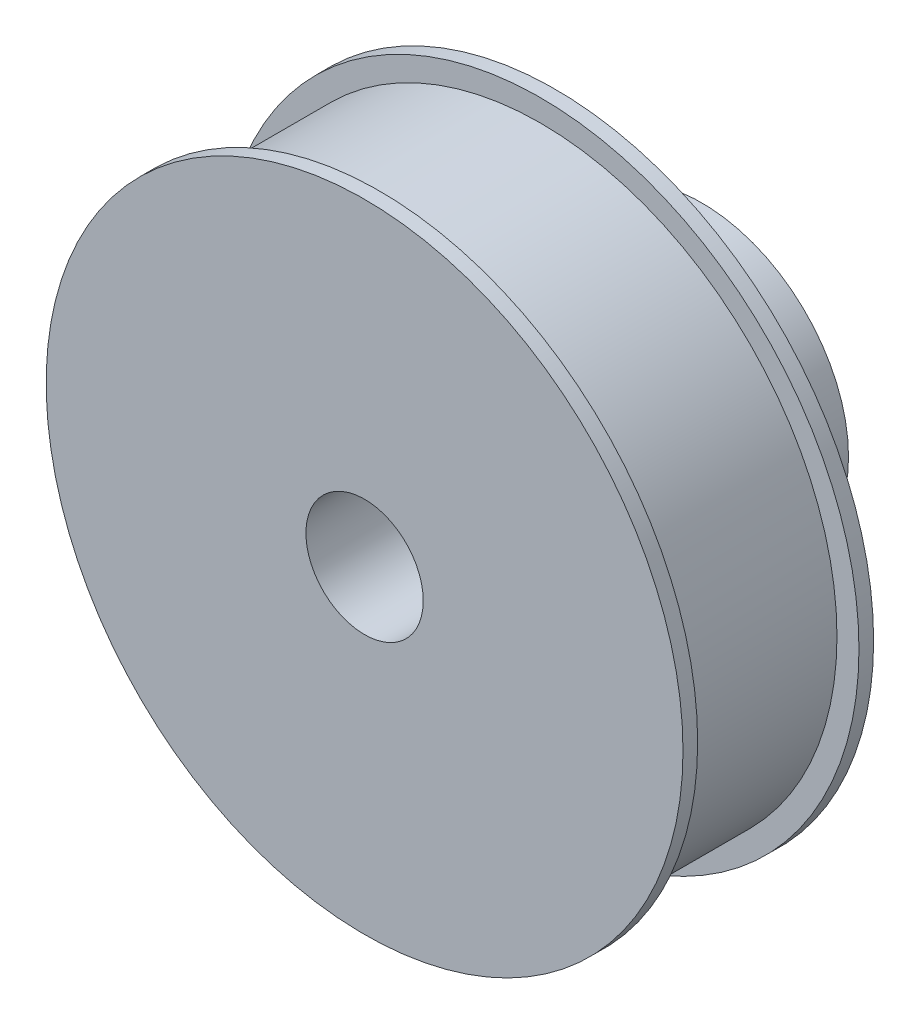
ISO-10303-21;
HEADER;
FILE_DESCRIPTION(('STEP AP214'),'2;1');
FILE_NAME('part.step','',(''),(''),'','','');
FILE_SCHEMA(('AUTOMOTIVE_DESIGN { 1 0 10303 214 1 1 1 1 }'));
ENDSEC;
DATA;
#1=APPLICATION_CONTEXT('core data for automotive mechanical design processes');
#2=APPLICATION_PROTOCOL_DEFINITION('international standard','automotive_design',2000,#1);
#3=PRODUCT_CONTEXT('',#1,'mechanical');
#4=PRODUCT('Part','Part','',(#3));
#5=PRODUCT_RELATED_PRODUCT_CATEGORY('part','',(#4));
#6=PRODUCT_DEFINITION_FORMATION('','',#4);
#7=PRODUCT_DEFINITION_CONTEXT('part definition',#1,'design');
#8=PRODUCT_DEFINITION('design','',#6,#7);
#9=PRODUCT_DEFINITION_SHAPE('','',#8);
#10=(LENGTH_UNIT() NAMED_UNIT(*) SI_UNIT(.MILLI.,.METRE.));
#11=(NAMED_UNIT(*) PLANE_ANGLE_UNIT() SI_UNIT($,.RADIAN.));
#12=(NAMED_UNIT(*) SI_UNIT($,.STERADIAN.) SOLID_ANGLE_UNIT());
#13=UNCERTAINTY_MEASURE_WITH_UNIT(LENGTH_MEASURE(1.E-05),#10,'distance_accuracy_value','');
#14=(GEOMETRIC_REPRESENTATION_CONTEXT(3) GLOBAL_UNCERTAINTY_ASSIGNED_CONTEXT((#13)) GLOBAL_UNIT_ASSIGNED_CONTEXT((#10,
#11,#12)) REPRESENTATION_CONTEXT('',''));
#15=CARTESIAN_POINT('',(0.,0.,0.));
#16=DIRECTION('',(0.,0.,1.));
#17=DIRECTION('',(1.,0.,0.));
#18=AXIS2_PLACEMENT_3D('',#15,#16,#17);
#19=CARTESIAN_POINT('',(0.,0.,-23.));
#20=DIRECTION('',(0.,0.,1.));
#21=DIRECTION('',(1.,0.,0.));
#22=AXIS2_PLACEMENT_3D('',#19,#20,#21);
#23=PLANE('',#22);
#24=CARTESIAN_POINT('',(0.,0.,-23.));
#25=DIRECTION('',(0.,0.,1.));
#26=DIRECTION('',(1.,0.,0.));
#27=AXIS2_PLACEMENT_3D('',#24,#25,#26);
#28=CIRCLE('',#27,4.);
#29=CARTESIAN_POINT('',(4.,0.,-23.));
#30=VERTEX_POINT('',#29);
#31=EDGE_CURVE('E77',#30,#30,#28,.T.);
#32=ORIENTED_EDGE('',*,*,#31,.T.);
#33=EDGE_LOOP('',(#32));
#34=FACE_BOUND('',#33,.T.);
#35=CARTESIAN_POINT('',(0.,0.,-23.));
#36=DIRECTION('',(0.,0.,1.));
#37=DIRECTION('',(1.,0.,0.));
#38=AXIS2_PLACEMENT_3D('',#35,#36,#37);
#39=CIRCLE('',#38,10.);
#40=CARTESIAN_POINT('',(10.,0.,-23.));
#41=VERTEX_POINT('',#40);
#42=EDGE_CURVE('E10',#41,#41,#39,.T.);
#43=ORIENTED_EDGE('',*,*,#42,.F.);
#44=EDGE_LOOP('',(#43));
#45=FACE_BOUND('',#44,.T.);
#46=ADVANCED_FACE('F32',(#34,#45),#23,.F.);
#47=CARTESIAN_POINT('',(0.,0.,0.));
#48=DIRECTION('',(0.,0.,1.));
#49=DIRECTION('',(1.,0.,0.));
#50=AXIS2_PLACEMENT_3D('',#47,#48,#49);
#51=CYLINDRICAL_SURFACE('',#50,10.);
#52=CARTESIAN_POINT('',(-10.,0.,-19.5));
#53=CARTESIAN_POINT('',(-9.99999865771297,0.0837515444816418,-19.4999965461847));
#54=CARTESIAN_POINT('',(-9.9989368253704,0.167551685082131,-19.4929619991594));
#55=CARTESIAN_POINT('',(-9.99480315973187,0.332809627994912,-19.4650168000172));
#56=CARTESIAN_POINT('',(-9.99172936938473,0.414265068974227,-19.4440926370551));
#57=CARTESIAN_POINT('',(-9.98391721219525,0.572418086221858,-19.3890074950324));
#58=CARTESIAN_POINT('',(-9.97918010370919,0.649119207826797,-19.354856520494));
#59=CARTESIAN_POINT('',(-9.96856475911724,0.795690428635252,-19.2743116205831));
#60=CARTESIAN_POINT('',(-9.96268668152773,0.865561474725186,-19.2279193955826));
#61=CARTESIAN_POINT('',(-9.95039170991452,0.997046719562123,-19.1238227350601));
#62=CARTESIAN_POINT('',(-9.94397133890331,1.0585998322255,-19.0660415437918));
#63=CARTESIAN_POINT('',(-9.93134261133238,1.17117490668948,-18.9409723111061));
#64=CARTESIAN_POINT('',(-9.92513426698505,1.22219626272935,-18.8736837232215));
#65=CARTESIAN_POINT('',(-9.91359877458726,1.31249729499943,-18.7310993564775));
#66=CARTESIAN_POINT('',(-9.90827611975031,1.35171787037205,-18.6557657530186));
#67=CARTESIAN_POINT('',(-9.89916211306267,1.41692632171056,-18.4994871793546));
#68=CARTESIAN_POINT('',(-9.89537067775448,1.44291491889163,-18.4185425152561));
#69=CARTESIAN_POINT('',(-9.88978256218673,1.48073198798911,-18.2539819581283));
#70=CARTESIAN_POINT('',(-9.8879711574125,1.49266503640517,-18.170390606592));
#71=CARTESIAN_POINT('',(-9.88650348970582,1.50235624033932,-18.0023738340127));
#72=CARTESIAN_POINT('',(-9.88684710303147,1.50011520973796,-17.9179484611375));
#73=CARTESIAN_POINT('',(-9.88963718352409,1.48160733250787,-17.7513989198058));
#74=CARTESIAN_POINT('',(-9.89206618761549,1.4654569592775,-17.6692614735152));
#75=CARTESIAN_POINT('',(-9.89872608126367,1.41977117403734,-17.5088756311285));
#76=CARTESIAN_POINT('',(-9.90295702179379,1.39023538337812,-17.4306273451192));
#77=CARTESIAN_POINT('',(-9.91276335545481,1.31849603529736,-17.2798866287171));
#78=CARTESIAN_POINT('',(-9.91834396766526,1.27624314283198,-17.2074180309076));
#79=CARTESIAN_POINT('',(-9.93021707574547,1.18030413128955,-17.0705554042181));
#80=CARTESIAN_POINT('',(-9.936509618325,1.12661726182478,-17.0061619057306));
#81=CARTESIAN_POINT('',(-9.94917473056209,1.00869493078248,-16.8866023392603));
#82=CARTESIAN_POINT('',(-9.95554747112815,0.944359329642001,-16.8315350097137));
#83=CARTESIAN_POINT('',(-9.96759647648462,0.807307089894186,-16.7329640654927));
#84=CARTESIAN_POINT('',(-9.9732727382251,0.734590414588169,-16.6894605014561));
#85=CARTESIAN_POINT('',(-9.98329515585393,0.582754598213685,-16.6152469135004));
#86=CARTESIAN_POINT('',(-9.98764051925427,0.50363167783678,-16.5845445081597));
#87=CARTESIAN_POINT('',(-9.99450490557069,0.341273182487062,-16.5368906103146));
#88=CARTESIAN_POINT('',(-9.99702405195467,0.258037885952602,-16.5199381881844));
#89=CARTESIAN_POINT('',(-9.99993581133871,0.0906695676436483,-16.5003967701833));
#90=CARTESIAN_POINT('',(-10.0003485209039,0.00655273187047231,-16.4976720286207));
#91=CARTESIAN_POINT('',(-9.99905561015226,-0.160936677662281,-16.506303005311));
#92=CARTESIAN_POINT('',(-9.99735005541368,-0.244309274381875,-16.5176582876681));
#93=CARTESIAN_POINT('',(-9.99202468615333,-0.407532387431406,-16.5540141001775));
#94=CARTESIAN_POINT('',(-9.98841415207984,-0.487397963079836,-16.5789484960308));
#95=CARTESIAN_POINT('',(-9.97968235658369,-0.641814958642998,-16.6416849974617));
#96=CARTESIAN_POINT('',(-9.97456102421565,-0.716366128795097,-16.6794877073336));
#97=CARTESIAN_POINT('',(-9.96332682468686,-0.858634979291919,-16.7672062245639));
#98=CARTESIAN_POINT('',(-9.95720701626745,-0.926299009891564,-16.8172081400128));
#99=CARTESIAN_POINT('',(-9.94467863012165,-1.0523236731777,-16.9277858116287));
#100=CARTESIAN_POINT('',(-9.93827003562867,-1.1106837647934,-16.9883621823246));
#101=CARTESIAN_POINT('',(-9.92582264304494,-1.21693784957195,-17.1189735331765));
#102=CARTESIAN_POINT('',(-9.91978736017588,-1.26474084747421,-17.1890829251948));
#103=CARTESIAN_POINT('',(-9.90883219104903,-1.34789129270584,-17.3364160405118));
#104=CARTESIAN_POINT('',(-9.90391227465628,-1.38323907656435,-17.4136395715215));
#105=CARTESIAN_POINT('',(-9.89577033008645,-1.44033467323943,-17.5727375336231));
#106=CARTESIAN_POINT('',(-9.89254233006438,-1.46213037141635,-17.6545944609712));
#107=CARTESIAN_POINT('',(-9.88813382297802,-1.49165549501586,-17.8208590154351));
#108=CARTESIAN_POINT('',(-9.88695317451771,-1.49938589183066,-17.9052664659947));
#109=CARTESIAN_POINT('',(-9.88677832610841,-1.50053786669439,-18.0733290633158));
#110=CARTESIAN_POINT('',(-9.88776226333502,-1.49410252167312,-18.1569832417569));
#111=CARTESIAN_POINT('',(-9.89175820611174,-1.46741229544378,-18.3220052633235));
#112=CARTESIAN_POINT('',(-9.89477020841117,-1.44715743638627,-18.4033731101134));
#113=CARTESIAN_POINT('',(-9.90247526112297,-1.39345373518665,-18.5614730822343));
#114=CARTESIAN_POINT('',(-9.90716703716075,-1.36001489324314,-18.6382086704334));
#115=CARTESIAN_POINT('',(-9.91770454557702,-1.28090667642309,-18.7850036338024));
#116=CARTESIAN_POINT('',(-9.92355031702723,-1.23523688741502,-18.8550627828036));
#117=CARTESIAN_POINT('',(-9.93580743364938,-1.13244337659164,-18.9872430579752));
#118=CARTESIAN_POINT('',(-9.94222367881967,-1.07521369039805,-19.0492813332471));
#119=CARTESIAN_POINT('',(-9.95485788826636,-0.951148841082832,-19.1629245547878));
#120=CARTESIAN_POINT('',(-9.96107580610759,-0.884311448350939,-19.2145270725761));
#121=CARTESIAN_POINT('',(-9.9726518579052,-0.74249570754372,-19.3060876766074));
#122=CARTESIAN_POINT('',(-9.9780050712882,-0.667474576764758,-19.3459801092147));
#123=CARTESIAN_POINT('',(-9.98720028802959,-0.511751870248718,-19.412538516758));
#124=CARTESIAN_POINT('',(-9.99104385565757,-0.431056277096703,-19.4392181900537));
#125=CARTESIAN_POINT('',(-9.99590939261505,-0.291665727889329,-19.4725413427101));
#126=CARTESIAN_POINT('',(-9.99743549179556,-0.233831133495278,-19.4828226015388));
#127=CARTESIAN_POINT('',(-9.99948125947895,-0.117338971600125,-19.4965530977126));
#128=CARTESIAN_POINT('',(-10.0000009404877,-0.0586814143344173,-19.5000024199525));
#129=CARTESIAN_POINT('',(-10.,0.,-19.5));
#130=B_SPLINE_CURVE_WITH_KNOTS('',3,(#52,#53,#54,#55,#56,#57,#58,#59,#60,#61,#62,#63,#64,#65,
#66,#67,#68,#69,#70,#71,#72,#73,#74,#75,#76,#77,#78,#79,#80,#81,#82,#83,#84,#85,#86,#87,#88,#89,
#90,#91,#92,#93,#94,#95,#96,#97,#98,#99,#100,#101,#102,#103,#104,#105,#106,#107,#108,#109,#110,
#111,#112,#113,#114,#115,#116,#117,#118,#119,#120,#121,#122,#123,#124,#125,#126,#127,#128,#129),
.UNSPECIFIED.,.T.,.F.,(4,2,2,2,2,2,2,2,2,2,2,2,2,2,2,2,2,2,2,2,2,2,2,2,2,2,2,2,2,2,2,2,2,2,2,2,
2,2,4),(0.,0.251040205031662,0.502324962929149,0.753420023583235,1.00448022419759,
1.25729416136843,1.5101226357258,1.76419702395375,2.01825756225505,2.27041564605924,
2.52255925098982,2.77261177195746,3.0226713669036,3.27371383476158,3.52477278308533,
3.77834291255408,4.03191415238667,4.28563608984873,4.539340871934,4.79062058544254,
5.04189251991154,5.29195148965947,5.54202220376272,5.79391188036906,6.04581620028628,
6.2998136658467,6.55380426808831,6.80689223457167,7.05996272137175,7.31048888261063,
7.56101464229562,7.81135073984145,8.06169531466878,8.31444829965719,8.56726003468731,
8.82146323384731,9.0754023326144,9.25129851978806,9.42719252123289),.UNSPECIFIED.);
#131=CARTESIAN_POINT('',(-10.,0.,-19.5));
#132=VERTEX_POINT('',#131);
#133=EDGE_CURVE('E57',#132,#132,#130,.T.);
#134=ORIENTED_EDGE('',*,*,#133,.T.);
#135=EDGE_LOOP('',(#134));
#136=FACE_BOUND('',#135,.T.);
#137=CARTESIAN_POINT('',(0.,-10.,-16.5));
#138=CARTESIAN_POINT('',(0.083751544481642,-9.99999865771297,-16.5000034538152));
#139=CARTESIAN_POINT('',(0.167551685082132,-9.9989368253704,-16.5070380008406));
#140=CARTESIAN_POINT('',(0.332809627994913,-9.99480315973187,-16.5349831999827));
#141=CARTESIAN_POINT('',(0.414265068974229,-9.99172936938473,-16.5559073629449));
#142=CARTESIAN_POINT('',(0.572418086221859,-9.98391721219525,-16.6109925049676));
#143=CARTESIAN_POINT('',(0.649119207826798,-9.97918010370919,-16.6451434795059));
#144=CARTESIAN_POINT('',(0.795690428635254,-9.96856475911724,-16.7256883794168));
#145=CARTESIAN_POINT('',(0.865561474725189,-9.96268668152772,-16.7720806044174));
#146=CARTESIAN_POINT('',(0.997046719562127,-9.95039170991452,-16.8761772649399));
#147=CARTESIAN_POINT('',(1.0585998322255,-9.94397133890331,-16.9339584562082));
#148=CARTESIAN_POINT('',(1.17117490668949,-9.93134261133238,-17.0590276888939));
#149=CARTESIAN_POINT('',(1.22219626272936,-9.92513426698505,-17.1263162767785));
#150=CARTESIAN_POINT('',(1.31249729499943,-9.91359877458726,-17.2689006435225));
#151=CARTESIAN_POINT('',(1.35171787037205,-9.90827611975031,-17.3442342469813));
#152=CARTESIAN_POINT('',(1.41692632171056,-9.89916211306267,-17.5005128206454));
#153=CARTESIAN_POINT('',(1.44291491889163,-9.89537067775448,-17.5814574847439));
#154=CARTESIAN_POINT('',(1.48073198798911,-9.88978256218673,-17.7460180418717));
#155=CARTESIAN_POINT('',(1.49266503640518,-9.8879711574125,-17.829609393408));
#156=CARTESIAN_POINT('',(1.50235624033932,-9.88650348970582,-17.9976261659873));
#157=CARTESIAN_POINT('',(1.50011520973796,-9.88684710303147,-18.0820515388625));
#158=CARTESIAN_POINT('',(1.48160733250788,-9.88963718352409,-18.2486010801941));
#159=CARTESIAN_POINT('',(1.4654569592775,-9.89206618761549,-18.3307385264848));
#160=CARTESIAN_POINT('',(1.41977117403734,-9.89872608126367,-18.4911243688715));
#161=CARTESIAN_POINT('',(1.39023538337812,-9.90295702179379,-18.5693726548807));
#162=CARTESIAN_POINT('',(1.31849603529737,-9.91276335545481,-18.7201133712828));
#163=CARTESIAN_POINT('',(1.27624314283198,-9.91834396766526,-18.7925819690924));
#164=CARTESIAN_POINT('',(1.18030413128955,-9.93021707574547,-18.9294445957819));
#165=CARTESIAN_POINT('',(1.12661726182478,-9.936509618325,-18.9938380942694));
#166=CARTESIAN_POINT('',(1.00869493078248,-9.94917473056209,-19.1133976607397));
#167=CARTESIAN_POINT('',(0.944359329642002,-9.95554747112815,-19.1684649902863));
#168=CARTESIAN_POINT('',(0.807307089894187,-9.96759647648462,-19.2670359345072));
#169=CARTESIAN_POINT('',(0.73459041458817,-9.9732727382251,-19.3105394985439));
#170=CARTESIAN_POINT('',(0.582754598213686,-9.98329515585393,-19.3847530864995));
#171=CARTESIAN_POINT('',(0.503631677836781,-9.98764051925427,-19.4154554918403));
#172=CARTESIAN_POINT('',(0.341273182487062,-9.99450490557069,-19.4631093896854));
#173=CARTESIAN_POINT('',(0.258037885952601,-9.99702405195467,-19.4800618118156));
#174=CARTESIAN_POINT('',(0.090669567643647,-9.99993581133871,-19.4996032298167));
#175=CARTESIAN_POINT('',(0.00655273187047097,-10.0003485209039,-19.5023279713793));
#176=CARTESIAN_POINT('',(-0.160936677662282,-9.99905561015226,-19.493696994689));
#177=CARTESIAN_POINT('',(-0.244309274381876,-9.99735005541368,-19.4823417123319));
#178=CARTESIAN_POINT('',(-0.407532387431407,-9.99202468615333,-19.4459858998224));
#179=CARTESIAN_POINT('',(-0.487397963079837,-9.98841415207984,-19.4210515039691));
#180=CARTESIAN_POINT('',(-0.641814958642999,-9.97968235658369,-19.3583150025382));
#181=CARTESIAN_POINT('',(-0.716366128795099,-9.97456102421565,-19.3205122926664));
#182=CARTESIAN_POINT('',(-0.85863497929192,-9.96332682468686,-19.2327937754361));
#183=CARTESIAN_POINT('',(-0.926299009891566,-9.95720701626745,-19.1827918599872));
#184=CARTESIAN_POINT('',(-1.05232367317771,-9.94467863012165,-19.0722141883712));
#185=CARTESIAN_POINT('',(-1.1106837647934,-9.93827003562867,-19.0116378176753));
#186=CARTESIAN_POINT('',(-1.21693784957195,-9.92582264304493,-18.8810264668235));
#187=CARTESIAN_POINT('',(-1.26474084747421,-9.91978736017588,-18.8109170748052));
#188=CARTESIAN_POINT('',(-1.34789129270584,-9.90883219104903,-18.6635839594882));
#189=CARTESIAN_POINT('',(-1.38323907656436,-9.90391227465628,-18.5863604284785));
#190=CARTESIAN_POINT('',(-1.44033467323943,-9.89577033008645,-18.4272624663769));
#191=CARTESIAN_POINT('',(-1.46213037141635,-9.89254233006438,-18.3454055390287));
#192=CARTESIAN_POINT('',(-1.49165549501586,-9.88813382297802,-18.1791409845649));
#193=CARTESIAN_POINT('',(-1.49938589183067,-9.88695317451771,-18.0947335340053));
#194=CARTESIAN_POINT('',(-1.5005378666944,-9.88677832610841,-17.9266709366842));
#195=CARTESIAN_POINT('',(-1.49410252167313,-9.88776226333502,-17.8430167582431));
#196=CARTESIAN_POINT('',(-1.46741229544379,-9.89175820611174,-17.6779947366765));
#197=CARTESIAN_POINT('',(-1.44715743638627,-9.89477020841117,-17.5966268898866));
#198=CARTESIAN_POINT('',(-1.39345373518665,-9.90247526112297,-17.4385269177657));
#199=CARTESIAN_POINT('',(-1.36001489324314,-9.90716703716075,-17.3617913295666));
#200=CARTESIAN_POINT('',(-1.28090667642309,-9.91770454557702,-17.2149963661976));
#201=CARTESIAN_POINT('',(-1.23523688741502,-9.92355031702723,-17.1449372171963));
#202=CARTESIAN_POINT('',(-1.13244337659164,-9.93580743364938,-17.0127569420248));
#203=CARTESIAN_POINT('',(-1.07521369039806,-9.94222367881967,-16.9507186667529));
#204=CARTESIAN_POINT('',(-0.951148841082838,-9.95485788826636,-16.8370754452122));
#205=CARTESIAN_POINT('',(-0.884311448350944,-9.96107580610759,-16.7854729274238));
#206=CARTESIAN_POINT('',(-0.742495707543725,-9.9726518579052,-16.6939123233926));
#207=CARTESIAN_POINT('',(-0.667474576764763,-9.9780050712882,-16.6540198907852));
#208=CARTESIAN_POINT('',(-0.511751870248721,-9.98720028802959,-16.5874614832419));
#209=CARTESIAN_POINT('',(-0.431056277096705,-9.99104385565757,-16.5607818099463));
#210=CARTESIAN_POINT('',(-0.291665727889329,-9.99590939261505,-16.5274586572899));
#211=CARTESIAN_POINT('',(-0.233831133495278,-9.99743549179556,-16.5171773984612));
#212=CARTESIAN_POINT('',(-0.117338971600125,-9.99948125947895,-16.5034469022873));
#213=CARTESIAN_POINT('',(-0.0586814143344171,-10.0000009404877,-16.4999975800474));
#214=CARTESIAN_POINT('',(0.,-10.,-16.5));
#215=B_SPLINE_CURVE_WITH_KNOTS('',3,(#137,#138,#139,#140,#141,#142,#143,#144,#145,#146,#147,
#148,#149,#150,#151,#152,#153,#154,#155,#156,#157,#158,#159,#160,#161,#162,#163,#164,#165,#166,
#167,#168,#169,#170,#171,#172,#173,#174,#175,#176,#177,#178,#179,#180,#181,#182,#183,#184,#185,
#186,#187,#188,#189,#190,#191,#192,#193,#194,#195,#196,#197,#198,#199,#200,#201,#202,#203,#204,
#205,#206,#207,#208,#209,#210,#211,#212,#213,#214),.UNSPECIFIED.,.T.,.F.,(4,2,2,2,2,2,2,2,2,2,2,
2,2,2,2,2,2,2,2,2,2,2,2,2,2,2,2,2,2,2,2,2,2,2,2,2,2,2,4),(0.,0.251040205031663,0.50232496292915,
0.753420023583236,1.0044802241976,1.25729416136843,1.5101226357258,1.76419702395375,
2.01825756225506,2.27041564605924,2.52255925098982,2.77261177195746,3.02267136690361,
3.27371383476159,3.52477278308534,3.77834291255409,4.03191415238668,4.28563608984874,
4.53934087193401,4.79062058544255,5.04189251991155,5.29195148965948,5.54202220376273,
5.79391188036908,6.04581620028629,6.29981366584671,6.55380426808832,6.80689223457168,
7.05996272137177,7.31048888261064,7.56101464229564,7.81135073984147,8.06169531466879,
8.3144482996572,8.56726003468733,8.82146323384733,9.07540233261441,9.25129851978808,
9.42719252123291),.UNSPECIFIED.);
#216=CARTESIAN_POINT('',(0.,-10.,-16.5));
#217=VERTEX_POINT('',#216);
#218=EDGE_CURVE('E56',#217,#217,#215,.T.);
#219=ORIENTED_EDGE('',*,*,#218,.T.);
#220=EDGE_LOOP('',(#219));
#221=FACE_BOUND('',#220,.T.);
#222=CARTESIAN_POINT('',(0.,0.,-13.));
#223=DIRECTION('',(0.,0.,1.));
#224=DIRECTION('',(1.,0.,0.));
#225=AXIS2_PLACEMENT_3D('',#222,#223,#224);
#226=CIRCLE('',#225,9.99999999999999);
#227=CARTESIAN_POINT('',(9.99999999999999,0.,-13.));
#228=VERTEX_POINT('',#227);
#229=EDGE_CURVE('E43',#228,#228,#226,.T.);
#230=ORIENTED_EDGE('',*,*,#229,.F.);
#231=EDGE_LOOP('',(#230));
#232=FACE_BOUND('',#231,.T.);
#233=ORIENTED_EDGE('',*,*,#42,.T.);
#234=EDGE_LOOP('',(#233));
#235=FACE_BOUND('',#234,.T.);
#236=ADVANCED_FACE('F79',(#136,#221,#232,#235),#51,.T.);
#237=CARTESIAN_POINT('',(-9.99999999999999,0.,-13.));
#238=DIRECTION('',(0.,0.,1.));
#239=DIRECTION('',(1.,0.,0.));
#240=AXIS2_PLACEMENT_3D('',#237,#238,#239);
#241=PLANE('',#240);
#242=CARTESIAN_POINT('',(0.,0.,-13.));
#243=DIRECTION('',(0.,0.,1.));
#244=DIRECTION('',(1.,0.,0.));
#245=AXIS2_PLACEMENT_3D('',#242,#243,#244);
#246=CIRCLE('',#245,21.7126777726707);
#247=CARTESIAN_POINT('',(21.7126777726707,0.,-13.));
#248=VERTEX_POINT('',#247);
#249=EDGE_CURVE('E48',#248,#248,#246,.T.);
#250=ORIENTED_EDGE('',*,*,#249,.F.);
#251=EDGE_LOOP('',(#250));
#252=FACE_BOUND('',#251,.T.);
#253=ORIENTED_EDGE('',*,*,#229,.T.);
#254=EDGE_LOOP('',(#253));
#255=FACE_BOUND('',#254,.T.);
#256=ADVANCED_FACE('F83',(#252,#255),#241,.F.);
#257=CARTESIAN_POINT('',(0.,0.,0.));
#258=DIRECTION('',(0.,0.,1.));
#259=DIRECTION('',(1.,0.,0.));
#260=AXIS2_PLACEMENT_3D('',#257,#258,#259);
#261=CYLINDRICAL_SURFACE('',#260,21.7126777726707);
#262=CARTESIAN_POINT('',(0.,0.,-12.));
#263=DIRECTION('',(0.,0.,1.));
#264=DIRECTION('',(1.,0.,0.));
#265=AXIS2_PLACEMENT_3D('',#262,#263,#264);
#266=CIRCLE('',#265,21.7126777726707);
#267=CARTESIAN_POINT('',(21.7126777726707,0.,-12.));
#268=VERTEX_POINT('',#267);
#269=EDGE_CURVE('E140',#268,#268,#266,.T.);
#270=ORIENTED_EDGE('',*,*,#269,.F.);
#271=EDGE_LOOP('',(#270));
#272=FACE_BOUND('',#271,.T.);
#273=ORIENTED_EDGE('',*,*,#249,.T.);
#274=EDGE_LOOP('',(#273));
#275=FACE_BOUND('',#274,.T.);
#276=ADVANCED_FACE('F88',(#272,#275),#261,.T.);
#277=CARTESIAN_POINT('',(-21.7126777726707,0.,-12.));
#278=DIRECTION('',(0.,0.,-1.));
#279=DIRECTION('',(-1.,0.,0.));
#280=AXIS2_PLACEMENT_3D('',#277,#278,#279);
#281=PLANE('',#280);
#282=CARTESIAN_POINT('',(0.,0.,-12.));
#283=DIRECTION('',(0.,0.,1.));
#284=DIRECTION('',(1.,0.,0.));
#285=AXIS2_PLACEMENT_3D('',#282,#283,#284);
#286=CIRCLE('',#285,20.2126777726707);
#287=CARTESIAN_POINT('',(20.2126777726707,0.,-12.));
#288=VERTEX_POINT('',#287);
#289=EDGE_CURVE('E137',#288,#288,#286,.T.);
#290=ORIENTED_EDGE('',*,*,#289,.F.);
#291=EDGE_LOOP('',(#290));
#292=FACE_BOUND('',#291,.T.);
#293=ORIENTED_EDGE('',*,*,#269,.T.);
#294=EDGE_LOOP('',(#293));
#295=FACE_BOUND('',#294,.T.);
#296=ADVANCED_FACE('F92',(#292,#295),#281,.F.);
#297=CARTESIAN_POINT('',(0.,0.,0.));
#298=DIRECTION('',(0.,0.,1.));
#299=DIRECTION('',(1.,0.,0.));
#300=AXIS2_PLACEMENT_3D('',#297,#298,#299);
#301=CYLINDRICAL_SURFACE('',#300,20.2126777726707);
#302=CARTESIAN_POINT('',(0.,0.,-1.));
#303=DIRECTION('',(0.,0.,1.));
#304=DIRECTION('',(1.,0.,0.));
#305=AXIS2_PLACEMENT_3D('',#302,#303,#304);
#306=CIRCLE('',#305,20.2126777726707);
#307=CARTESIAN_POINT('',(20.2126777726707,0.,-1.));
#308=VERTEX_POINT('',#307);
#309=EDGE_CURVE('E134',#308,#308,#306,.T.);
#310=ORIENTED_EDGE('',*,*,#309,.F.);
#311=EDGE_LOOP('',(#310));
#312=FACE_BOUND('',#311,.T.);
#313=ORIENTED_EDGE('',*,*,#289,.T.);
#314=EDGE_LOOP('',(#313));
#315=FACE_BOUND('',#314,.T.);
#316=ADVANCED_FACE('F96',(#312,#315),#301,.T.);
#317=CARTESIAN_POINT('',(-20.2126777726707,0.,-1.));
#318=DIRECTION('',(0.,0.,1.));
#319=DIRECTION('',(1.,0.,0.));
#320=AXIS2_PLACEMENT_3D('',#317,#318,#319);
#321=PLANE('',#320);
#322=CARTESIAN_POINT('',(0.,0.,-1.));
#323=DIRECTION('',(0.,0.,1.));
#324=DIRECTION('',(1.,0.,0.));
#325=AXIS2_PLACEMENT_3D('',#322,#323,#324);
#326=CIRCLE('',#325,21.7126777726707);
#327=CARTESIAN_POINT('',(21.7126777726707,0.,-1.));
#328=VERTEX_POINT('',#327);
#329=EDGE_CURVE('E127',#328,#328,#326,.T.);
#330=ORIENTED_EDGE('',*,*,#329,.F.);
#331=EDGE_LOOP('',(#330));
#332=FACE_BOUND('',#331,.T.);
#333=ORIENTED_EDGE('',*,*,#309,.T.);
#334=EDGE_LOOP('',(#333));
#335=FACE_BOUND('',#334,.T.);
#336=ADVANCED_FACE('F100',(#332,#335),#321,.F.);
#337=CARTESIAN_POINT('',(0.,0.,0.));
#338=DIRECTION('',(0.,0.,1.));
#339=DIRECTION('',(1.,0.,0.));
#340=AXIS2_PLACEMENT_3D('',#337,#338,#339);
#341=CYLINDRICAL_SURFACE('',#340,21.7126777726707);
#342=CARTESIAN_POINT('',(0.,0.,0.));
#343=DIRECTION('',(0.,0.,1.));
#344=DIRECTION('',(1.,0.,0.));
#345=AXIS2_PLACEMENT_3D('',#342,#343,#344);
#346=CIRCLE('',#345,21.7126777726707);
#347=CARTESIAN_POINT('',(21.7126777726707,0.,0.));
#348=VERTEX_POINT('',#347);
#349=EDGE_CURVE('E125',#348,#348,#346,.T.);
#350=ORIENTED_EDGE('',*,*,#349,.F.);
#351=EDGE_LOOP('',(#350));
#352=FACE_BOUND('',#351,.T.);
#353=ORIENTED_EDGE('',*,*,#329,.T.);
#354=EDGE_LOOP('',(#353));
#355=FACE_BOUND('',#354,.T.);
#356=ADVANCED_FACE('F104',(#352,#355),#341,.T.);
#357=CARTESIAN_POINT('',(-21.7126777726707,0.,0.));
#358=DIRECTION('',(0.,0.,-1.));
#359=DIRECTION('',(-1.,0.,0.));
#360=AXIS2_PLACEMENT_3D('',#357,#358,#359);
#361=PLANE('',#360);
#362=CARTESIAN_POINT('',(0.,0.,0.));
#363=DIRECTION('',(0.,0.,1.));
#364=DIRECTION('',(1.,0.,0.));
#365=AXIS2_PLACEMENT_3D('',#362,#363,#364);
#366=CIRCLE('',#365,4.);
#367=CARTESIAN_POINT('',(4.,0.,0.));
#368=VERTEX_POINT('',#367);
#369=EDGE_CURVE('E74',#368,#368,#366,.T.);
#370=ORIENTED_EDGE('',*,*,#369,.F.);
#371=EDGE_LOOP('',(#370));
#372=FACE_BOUND('',#371,.T.);
#373=ORIENTED_EDGE('',*,*,#349,.T.);
#374=EDGE_LOOP('',(#373));
#375=FACE_BOUND('',#374,.T.);
#376=ADVANCED_FACE('F107',(#372,#375),#361,.F.);
#377=CARTESIAN_POINT('',(0.,0.,-23.));
#378=DIRECTION('',(0.,0.,1.));
#379=DIRECTION('',(1.,0.,0.));
#380=AXIS2_PLACEMENT_3D('',#377,#378,#379);
#381=CYLINDRICAL_SURFACE('',#380,4.);
#382=CARTESIAN_POINT('',(-4.,0.,-19.5));
#383=CARTESIAN_POINT('',(-4.00000217456151,-0.0812350589378525,-19.5000029023031));
#384=CARTESIAN_POINT('',(-3.99750379283184,-0.162450241781792,-19.4933802397516));
#385=CARTESIAN_POINT('',(-3.98778696006928,-0.32245345235236,-19.4671718047301));
#386=CARTESIAN_POINT('',(-3.98056918893993,-0.401241827987615,-19.4475878995294));
#387=CARTESIAN_POINT('',(-3.96218832391545,-0.554060784990877,-19.3962469982282));
#388=CARTESIAN_POINT('',(-3.9510328434944,-0.628100224162275,-19.3645134831782));
#389=CARTESIAN_POINT('',(-3.92588767765353,-0.76979931016025,-19.2898935869842));
#390=CARTESIAN_POINT('',(-3.91189723227548,-0.837457239177876,-19.2470042144558));
#391=CARTESIAN_POINT('',(-3.88186246971217,-0.967346417045822,-19.1493874689291));
#392=CARTESIAN_POINT('',(-3.86576002583566,-1.02927073015119,-19.0942697377406));
#393=CARTESIAN_POINT('',(-3.83360220871327,-1.14324421474363,-18.9745895653411));
#394=CARTESIAN_POINT('',(-3.81754685135033,-1.19529036359202,-18.9100242439121));
#395=CARTESIAN_POINT('',(-3.78662470617731,-1.28998202215985,-18.7702825324768));
#396=CARTESIAN_POINT('',(-3.77182648820818,-1.33219393195759,-18.6947956334542));
#397=CARTESIAN_POINT('',(-3.74599860237433,-1.40318646334084,-18.5371516458315));
#398=CARTESIAN_POINT('',(-3.73496742975881,-1.43197244961239,-18.4549972368449));
#399=CARTESIAN_POINT('',(-3.71854412824136,-1.47408431017549,-18.2898832597418));
#400=CARTESIAN_POINT('',(-3.71293924350838,-1.48799593218557,-18.2070949615645));
#401=CARTESIAN_POINT('',(-3.70738061461215,-1.50179556531648,-18.0401838420061));
#402=CARTESIAN_POINT('',(-3.70742453659305,-1.5016893680263,-17.9560615861255));
#403=CARTESIAN_POINT('',(-3.71297511632055,-1.48790429610018,-17.794230474787));
#404=CARTESIAN_POINT('',(-3.71815468871122,-1.47503808509003,-17.7164390939558));
#405=CARTESIAN_POINT('',(-3.7328493805953,-1.4374416786833,-17.5642128495947));
#406=CARTESIAN_POINT('',(-3.74236515298863,-1.41270969663258,-17.4897784933861));
#407=CARTESIAN_POINT('',(-3.76485702190253,-1.35163748571903,-17.3447229322718));
#408=CARTESIAN_POINT('',(-3.77789517988166,-1.315086487371,-17.2742005138787));
#409=CARTESIAN_POINT('',(-3.80594210139319,-1.23156073762697,-17.140054262409));
#410=CARTESIAN_POINT('',(-3.82095154457158,-1.18458238728896,-17.0764328224803));
#411=CARTESIAN_POINT('',(-3.85248038859113,-1.07781780766548,-16.9533963363491));
#412=CARTESIAN_POINT('',(-3.86903347455671,-1.01738298716955,-16.8945513592519));
#413=CARTESIAN_POINT('',(-3.90091728164086,-0.887312590819019,-16.7876620337942));
#414=CARTESIAN_POINT('',(-3.91624781465952,-0.817675603497362,-16.7396193453943));
#415=CARTESIAN_POINT('',(-3.9442639480908,-0.669723436992419,-16.6550696029375));
#416=CARTESIAN_POINT('',(-3.95690498259616,-0.591290713844719,-16.6187524187789));
#417=CARTESIAN_POINT('',(-3.97778718326962,-0.428836850524584,-16.56001739573));
#418=CARTESIAN_POINT('',(-3.98603030341493,-0.344818210845768,-16.5375933834389));
#419=CARTESIAN_POINT('',(-3.99684443228065,-0.178375243148666,-16.5083772124581));
#420=CARTESIAN_POINT('',(-3.99969369025686,-0.0961036195622105,-16.5008173936175));
#421=CARTESIAN_POINT('',(-4.00025893700126,0.0685724752550229,-16.4993089361001));
#422=CARTESIAN_POINT('',(-3.99797606386863,0.150976912983371,-16.5053572796832));
#423=CARTESIAN_POINT('',(-3.98871709772643,0.310262048561858,-16.5303100423087));
#424=CARTESIAN_POINT('',(-3.98192470962305,0.387233328007334,-16.5487115437371));
#425=CARTESIAN_POINT('',(-3.96451477091717,0.536941754957219,-16.5971860725473));
#426=CARTESIAN_POINT('',(-3.9538967228203,0.609678350347532,-16.627260617948));
#427=CARTESIAN_POINT('',(-3.92949624407682,0.751247765110152,-16.6991864124395));
#428=CARTESIAN_POINT('',(-3.91563000209348,0.819903083557792,-16.7413577292234));
#429=CARTESIAN_POINT('',(-3.88626671564664,0.949392711726622,-16.8359181031715));
#430=CARTESIAN_POINT('',(-3.87076907009516,1.01022412027045,-16.8883109325451));
#431=CARTESIAN_POINT('',(-3.8387332949099,1.12603079874454,-17.0054041221243));
#432=CARTESIAN_POINT('',(-3.82218696503729,1.18046154123568,-17.0706421827727));
#433=CARTESIAN_POINT('',(-3.79078815746854,1.27771050031903,-17.2096513847077));
#434=CARTESIAN_POINT('',(-3.77593583194399,1.32052767414518,-17.2834232913885));
#435=CARTESIAN_POINT('',(-3.74966829822463,1.39337773518997,-17.4380159867723));
#436=CARTESIAN_POINT('',(-3.73826760328493,1.42335685446918,-17.5188647459104));
#437=CARTESIAN_POINT('',(-3.72054032891005,1.46907883466889,-17.6850097636878));
#438=CARTESIAN_POINT('',(-3.71421061057491,1.48483050305535,-17.7703032361981));
#439=CARTESIAN_POINT('',(-3.70775894792574,1.50086347097839,-17.9370161595411));
#440=CARTESIAN_POINT('',(-3.70726444523341,1.50207331495837,-18.0183326317169));
#441=CARTESIAN_POINT('',(-3.71158412745292,1.49136715641592,-18.1799453162762));
#442=CARTESIAN_POINT('',(-3.71639780898899,1.47945239850123,-18.2602416246716));
#443=CARTESIAN_POINT('',(-3.73048141585433,1.44355815630241,-18.4150472267165));
#444=CARTESIAN_POINT('',(-3.73961085376663,1.41995798316524,-18.4896583462453));
#445=CARTESIAN_POINT('',(-3.76121548297845,1.36169696779919,-18.6339055084944));
#446=CARTESIAN_POINT('',(-3.77369151995215,1.32703332944944,-18.7035402880701));
#447=CARTESIAN_POINT('',(-3.80139723903965,1.24552075938154,-18.8398267896976));
#448=CARTESIAN_POINT('',(-3.81673698440964,1.1981283280301,-18.9061307967999));
#449=CARTESIAN_POINT('',(-3.84806246757177,1.09334485729906,-19.0301415609712));
#450=CARTESIAN_POINT('',(-3.86404840943145,1.03595064012808,-19.0878455747867));
#451=CARTESIAN_POINT('',(-3.89590424609881,0.909080396784621,-19.1962019558218));
#452=CARTESIAN_POINT('',(-3.91172104900645,0.839118644212989,-19.2463037534347));
#453=CARTESIAN_POINT('',(-3.94054514457031,0.691213223200818,-19.3340226552765));
#454=CARTESIAN_POINT('',(-3.95355221851559,0.61326893409062,-19.3716387877364));
#455=CARTESIAN_POINT('',(-3.9757429260668,0.447999082002312,-19.4343768290483));
#456=CARTESIAN_POINT('',(-3.98473657158356,0.360413422234208,-19.4588870646019));
#457=CARTESIAN_POINT('',(-3.99686242179587,0.181875733606382,-19.4916929599207));
#458=CARTESIAN_POINT('',(-3.99999756603967,0.0909254163648588,-19.4999967514873));
#459=CARTESIAN_POINT('',(-4.,0.,-19.5));
#460=B_SPLINE_CURVE_WITH_KNOTS('',3,(#382,#383,#384,#385,#386,#387,#388,#389,#390,#391,#392,
#393,#394,#395,#396,#397,#398,#399,#400,#401,#402,#403,#404,#405,#406,#407,#408,#409,#410,#411,
#412,#413,#414,#415,#416,#417,#418,#419,#420,#421,#422,#423,#424,#425,#426,#427,#428,#429,#430,
#431,#432,#433,#434,#435,#436,#437,#438,#439,#440,#441,#442,#443,#444,#445,#446,#447,#448,#449,
#450,#451,#452,#453,#454,#455,#456,#457,#458,#459),.UNSPECIFIED.,.T.,.F.,(4,2,2,2,2,2,2,2,2,2,2,
2,2,2,2,2,2,2,2,2,2,2,2,2,2,2,2,2,2,2,2,2,2,2,2,2,2,2,4),(0.,0.243369801560559,
0.486704549530459,0.729571369213569,0.972503379609486,1.22473618582715,1.47704604925621,
1.73896674501658,2.00078269352133,2.25185874416901,2.50283106079707,2.73878345119971,
2.97477138060589,3.21522408387018,3.45575990744258,3.71246153335812,3.96920257905065,
4.22991375286074,4.49050899698845,4.73725019635924,4.98393668390519,5.22114437923839,
5.45838293254452,5.70259221859598,5.94689180019866,6.20536519455657,6.4638617892014,
6.72343066727203,6.98283874956505,7.22558763480251,7.46831350211257,7.70363142426531,
7.93900886656504,8.18672471884269,8.4345194199706,8.69572329654037,8.956947498051,
9.2294851503204,9.50188601796125),.UNSPECIFIED.);
#461=CARTESIAN_POINT('',(-4.,0.,-19.5));
#462=VERTEX_POINT('',#461);
#463=EDGE_CURVE('E35',#462,#462,#460,.T.);
#464=ORIENTED_EDGE('',*,*,#463,.T.);
#465=EDGE_LOOP('',(#464));
#466=FACE_BOUND('',#465,.T.);
#467=CARTESIAN_POINT('',(0.,-4.,-16.5));
#468=CARTESIAN_POINT('',(-0.0812350589378528,-4.00000217456151,-16.4999970976969));
#469=CARTESIAN_POINT('',(-0.162450241781792,-3.99750379283184,-16.5066197602484));
#470=CARTESIAN_POINT('',(-0.322453452352361,-3.98778696006928,-16.5328281952699));
#471=CARTESIAN_POINT('',(-0.401241827987616,-3.98056918893993,-16.5524121004706));
#472=CARTESIAN_POINT('',(-0.554060784990879,-3.96218832391545,-16.6037530017718));
#473=CARTESIAN_POINT('',(-0.628100224162278,-3.9510328434944,-16.6354865168218));
#474=CARTESIAN_POINT('',(-0.769799310160254,-3.92588767765353,-16.7101064130158));
#475=CARTESIAN_POINT('',(-0.83745723917788,-3.91189723227548,-16.7529957855441));
#476=CARTESIAN_POINT('',(-0.967346417045826,-3.88186246971217,-16.8506125310709));
#477=CARTESIAN_POINT('',(-1.02927073015119,-3.86576002583566,-16.9057302622594));
#478=CARTESIAN_POINT('',(-1.14324421474363,-3.83360220871327,-17.0254104346588));
#479=CARTESIAN_POINT('',(-1.19529036359203,-3.81754685135033,-17.0899757560879));
#480=CARTESIAN_POINT('',(-1.28998202215985,-3.78662470617731,-17.2297174675232));
#481=CARTESIAN_POINT('',(-1.3321939319576,-3.77182648820818,-17.3052043665458));
#482=CARTESIAN_POINT('',(-1.40318646334085,-3.74599860237433,-17.4628483541685));
#483=CARTESIAN_POINT('',(-1.43197244961239,-3.73496742975881,-17.5450027631551));
#484=CARTESIAN_POINT('',(-1.47408431017549,-3.71854412824136,-17.7101167402582));
#485=CARTESIAN_POINT('',(-1.48799593218558,-3.71293924350838,-17.7929050384354));
#486=CARTESIAN_POINT('',(-1.50179556531648,-3.70738061461215,-17.9598161579938));
#487=CARTESIAN_POINT('',(-1.50168936802631,-3.70742453659305,-18.0439384138745));
#488=CARTESIAN_POINT('',(-1.48790429610018,-3.71297511632055,-18.2057695252129));
#489=CARTESIAN_POINT('',(-1.47503808509003,-3.71815468871122,-18.2835609060442));
#490=CARTESIAN_POINT('',(-1.4374416786833,-3.73284938059529,-18.4357871504053));
#491=CARTESIAN_POINT('',(-1.41270969663258,-3.74236515298863,-18.5102215066139));
#492=CARTESIAN_POINT('',(-1.35163748571904,-3.76485702190253,-18.6552770677282));
#493=CARTESIAN_POINT('',(-1.31508648737101,-3.77789517988166,-18.7257994861213));
#494=CARTESIAN_POINT('',(-1.23156073762698,-3.80594210139319,-18.859945737591));
#495=CARTESIAN_POINT('',(-1.18458238728897,-3.82095154457158,-18.9235671775197));
#496=CARTESIAN_POINT('',(-1.07781780766549,-3.85248038859113,-19.0466036636509));
#497=CARTESIAN_POINT('',(-1.01738298716956,-3.86903347455671,-19.1054486407481));
#498=CARTESIAN_POINT('',(-0.887312590819021,-3.90091728164085,-19.2123379662058));
#499=CARTESIAN_POINT('',(-0.817675603497364,-3.91624781465952,-19.2603806546057));
#500=CARTESIAN_POINT('',(-0.669723436992419,-3.9442639480908,-19.3449303970625));
#501=CARTESIAN_POINT('',(-0.591290713844718,-3.95690498259616,-19.3812475812211));
#502=CARTESIAN_POINT('',(-0.428836850524582,-3.97778718326962,-19.43998260427));
#503=CARTESIAN_POINT('',(-0.344818210845767,-3.98603030341493,-19.4624066165611));
#504=CARTESIAN_POINT('',(-0.178375243148665,-3.99684443228065,-19.4916227875419));
#505=CARTESIAN_POINT('',(-0.0961036195622087,-3.99969369025686,-19.4991826063825));
#506=CARTESIAN_POINT('',(0.0685724752550249,-4.00025893700126,-19.5006910638999));
#507=CARTESIAN_POINT('',(0.150976912983374,-3.99797606386863,-19.4946427203168));
#508=CARTESIAN_POINT('',(0.31026204856186,-3.98871709772643,-19.4696899576913));
#509=CARTESIAN_POINT('',(0.387233328007337,-3.98192470962305,-19.4512884562629));
#510=CARTESIAN_POINT('',(0.536941754957222,-3.96451477091717,-19.4028139274527));
#511=CARTESIAN_POINT('',(0.609678350347535,-3.9538967228203,-19.372739382052));
#512=CARTESIAN_POINT('',(0.751247765110156,-3.92949624407681,-19.3008135875605));
#513=CARTESIAN_POINT('',(0.819903083557796,-3.91563000209348,-19.2586422707766));
#514=CARTESIAN_POINT('',(0.949392711726626,-3.88626671564664,-19.1640818968284));
#515=CARTESIAN_POINT('',(1.01022412027045,-3.87076907009516,-19.1116890674548));
#516=CARTESIAN_POINT('',(1.12603079874454,-3.83873329490989,-18.9945958778757));
#517=CARTESIAN_POINT('',(1.18046154123569,-3.82218696503729,-18.9293578172273));
#518=CARTESIAN_POINT('',(1.27771050031903,-3.79078815746854,-18.7903486152923));
#519=CARTESIAN_POINT('',(1.32052767414519,-3.77593583194399,-18.7165767086115));
#520=CARTESIAN_POINT('',(1.39337773518998,-3.74966829822463,-18.5619840132277));
#521=CARTESIAN_POINT('',(1.42335685446918,-3.73826760328493,-18.4811352540896));
#522=CARTESIAN_POINT('',(1.46907883466889,-3.72054032891005,-18.3149902363122));
#523=CARTESIAN_POINT('',(1.48483050305535,-3.71421061057491,-18.2296967638019));
#524=CARTESIAN_POINT('',(1.50086347097839,-3.70775894792573,-18.0629838404589));
#525=CARTESIAN_POINT('',(1.50207331495837,-3.70726444523341,-17.9816673682831));
#526=CARTESIAN_POINT('',(1.49136715641593,-3.71158412745292,-17.8200546837238));
#527=CARTESIAN_POINT('',(1.47945239850124,-3.71639780898899,-17.7397583753284));
#528=CARTESIAN_POINT('',(1.44355815630242,-3.73048141585432,-17.5849527732834));
#529=CARTESIAN_POINT('',(1.41995798316524,-3.73961085376663,-17.5103416537546));
#530=CARTESIAN_POINT('',(1.3616969677992,-3.76121548297845,-17.3660944915056));
#531=CARTESIAN_POINT('',(1.32703332944945,-3.77369151995215,-17.2964597119298));
#532=CARTESIAN_POINT('',(1.24552075938154,-3.80139723903965,-17.1601732103024));
#533=CARTESIAN_POINT('',(1.1981283280301,-3.81673698440964,-17.0938692032001));
#534=CARTESIAN_POINT('',(1.09334485729906,-3.84806246757177,-16.9698584390288));
#535=CARTESIAN_POINT('',(1.03595064012808,-3.86404840943145,-16.9121544252132));
#536=CARTESIAN_POINT('',(0.909080396784623,-3.89590424609881,-16.8037980441781));
#537=CARTESIAN_POINT('',(0.839118644212993,-3.91172104900645,-16.7536962465653));
#538=CARTESIAN_POINT('',(0.691213223200822,-3.94054514457031,-16.6659773447234));
#539=CARTESIAN_POINT('',(0.613268934090622,-3.95355221851559,-16.6283612122636));
#540=CARTESIAN_POINT('',(0.447999082002312,-3.9757429260668,-16.5656231709517));
#541=CARTESIAN_POINT('',(0.360413422234208,-3.98473657158356,-16.5411129353981));
#542=CARTESIAN_POINT('',(0.181875733606382,-3.99686242179587,-16.5083070400793));
#543=CARTESIAN_POINT('',(0.0909254163648589,-3.99999756603967,-16.5000032485127));
#544=CARTESIAN_POINT('',(0.,-4.,-16.5));
#545=B_SPLINE_CURVE_WITH_KNOTS('',3,(#467,#468,#469,#470,#471,#472,#473,#474,#475,#476,#477,
#478,#479,#480,#481,#482,#483,#484,#485,#486,#487,#488,#489,#490,#491,#492,#493,#494,#495,#496,
#497,#498,#499,#500,#501,#502,#503,#504,#505,#506,#507,#508,#509,#510,#511,#512,#513,#514,#515,
#516,#517,#518,#519,#520,#521,#522,#523,#524,#525,#526,#527,#528,#529,#530,#531,#532,#533,#534,
#535,#536,#537,#538,#539,#540,#541,#542,#543,#544),.UNSPECIFIED.,.T.,.F.,(4,2,2,2,2,2,2,2,2,2,2,
2,2,2,2,2,2,2,2,2,2,2,2,2,2,2,2,2,2,2,2,2,2,2,2,2,2,2,4),(0.,0.24336980156056,0.48670454953046,
0.729571369213575,0.972503379609491,1.22473618582716,1.47704604925622,1.73896674501659,
2.00078269352134,2.25185874416902,2.50283106079707,2.73878345119971,2.97477138060589,
3.21522408387018,3.45575990744258,3.71246153335813,3.96920257905066,4.22991375286075,
4.49050899698846,4.73725019635926,4.98393668390521,5.2211443792384,5.45838293254454,
5.702592218596,5.94689180019868,6.20536519455658,6.46386178920141,6.72343066727204,
6.98283874956507,7.22558763480252,7.46831350211259,7.70363142426533,7.93900886656507,
8.18672471884272,8.43451941997062,8.69572329654039,8.95694749805102,9.22948515032042,
9.50188601796128),.UNSPECIFIED.);
#546=CARTESIAN_POINT('',(0.,-4.,-16.5));
#547=VERTEX_POINT('',#546);
#548=EDGE_CURVE('E51',#547,#547,#545,.T.);
#549=ORIENTED_EDGE('',*,*,#548,.T.);
#550=EDGE_LOOP('',(#549));
#551=FACE_BOUND('',#550,.T.);
#552=ORIENTED_EDGE('',*,*,#31,.F.);
#553=EDGE_LOOP('',(#552));
#554=FACE_BOUND('',#553,.T.);
#555=ORIENTED_EDGE('',*,*,#369,.T.);
#556=EDGE_LOOP('',(#555));
#557=FACE_BOUND('',#556,.T.);
#558=ADVANCED_FACE('F58',(#466,#551,#554,#557),#381,.F.);
#559=CARTESIAN_POINT('',(0.,-21.7126777726707,-18.));
#560=DIRECTION('',(0.,1.,0.));
#561=DIRECTION('',(0.,0.,1.));
#562=AXIS2_PLACEMENT_3D('',#559,#560,#561);
#563=CYLINDRICAL_SURFACE('',#562,1.5);
#564=ORIENTED_EDGE('',*,*,#548,.F.);
#565=EDGE_LOOP('',(#564));
#566=FACE_BOUND('',#565,.T.);
#567=ORIENTED_EDGE('',*,*,#218,.F.);
#568=EDGE_LOOP('',(#567));
#569=FACE_BOUND('',#568,.T.);
#570=ADVANCED_FACE('F61',(#566,#569),#563,.F.);
#571=CARTESIAN_POINT('',(-21.7126777726707,0.,-18.));
#572=DIRECTION('',(1.,0.,0.));
#573=DIRECTION('',(0.,0.,-1.));
#574=AXIS2_PLACEMENT_3D('',#571,#572,#573);
#575=CYLINDRICAL_SURFACE('',#574,1.5);
#576=ORIENTED_EDGE('',*,*,#463,.F.);
#577=EDGE_LOOP('',(#576));
#578=FACE_BOUND('',#577,.T.);
#579=ORIENTED_EDGE('',*,*,#133,.F.);
#580=EDGE_LOOP('',(#579));
#581=FACE_BOUND('',#580,.T.);
#582=ADVANCED_FACE('F64',(#578,#581),#575,.F.);
#583=CLOSED_SHELL('',(#46,#236,#256,#276,#296,#316,#336,#356,#376,#558,#570,#582));
#584=MANIFOLD_SOLID_BREP('B2',#583);
#585=ADVANCED_BREP_SHAPE_REPRESENTATION('',(#18,#584),#14);
#586=SHAPE_DEFINITION_REPRESENTATION(#9,#585);
ENDSEC;
END-ISO-10303-21;
